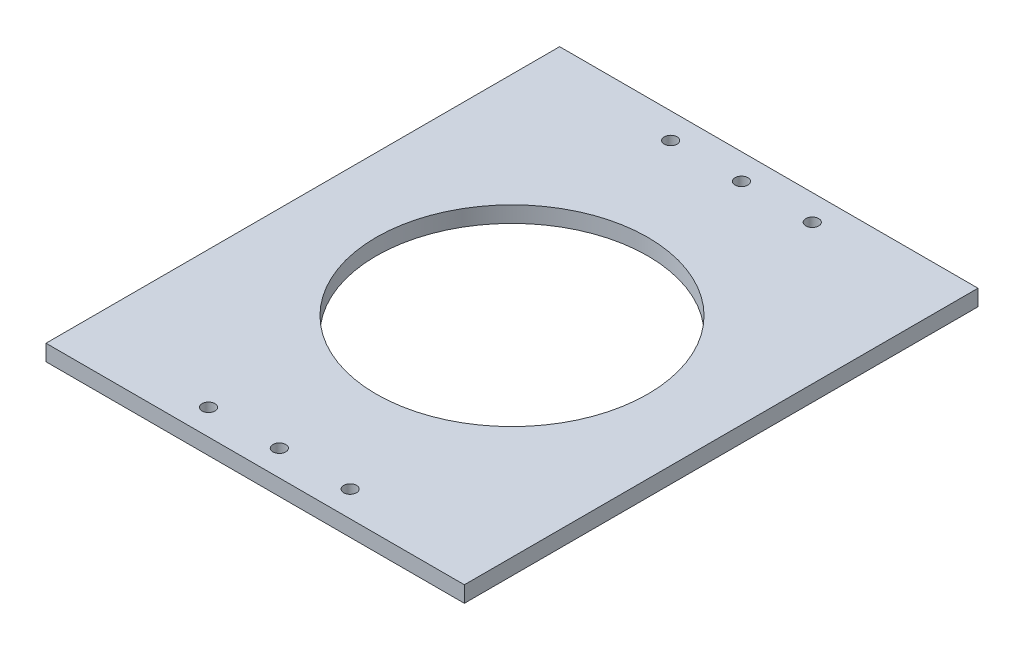
ISO-10303-21;
HEADER;
FILE_DESCRIPTION(('STEP AP214'),'2;1');
FILE_NAME('part.step','',(''),(''),'','','');
FILE_SCHEMA(('AUTOMOTIVE_DESIGN { 1 0 10303 214 1 1 1 1 }'));
ENDSEC;
DATA;
#1=APPLICATION_CONTEXT('core data for automotive mechanical design processes');
#2=APPLICATION_PROTOCOL_DEFINITION('international standard','automotive_design',2000,#1);
#3=PRODUCT_CONTEXT('',#1,'mechanical');
#4=PRODUCT('Part','Part','',(#3));
#5=PRODUCT_RELATED_PRODUCT_CATEGORY('part','',(#4));
#6=PRODUCT_DEFINITION_FORMATION('','',#4);
#7=PRODUCT_DEFINITION_CONTEXT('part definition',#1,'design');
#8=PRODUCT_DEFINITION('design','',#6,#7);
#9=PRODUCT_DEFINITION_SHAPE('','',#8);
#10=(LENGTH_UNIT() NAMED_UNIT(*) SI_UNIT(.MILLI.,.METRE.));
#11=(NAMED_UNIT(*) PLANE_ANGLE_UNIT() SI_UNIT($,.RADIAN.));
#12=(NAMED_UNIT(*) SI_UNIT($,.STERADIAN.) SOLID_ANGLE_UNIT());
#13=UNCERTAINTY_MEASURE_WITH_UNIT(LENGTH_MEASURE(1.E-05),#10,'distance_accuracy_value','');
#14=(GEOMETRIC_REPRESENTATION_CONTEXT(3) GLOBAL_UNCERTAINTY_ASSIGNED_CONTEXT((#13)) GLOBAL_UNIT_ASSIGNED_CONTEXT((#10,
#11,#12)) REPRESENTATION_CONTEXT('',''));
#15=CARTESIAN_POINT('',(0.,0.,0.));
#16=DIRECTION('',(0.,0.,1.));
#17=DIRECTION('',(1.,0.,0.));
#18=AXIS2_PLACEMENT_3D('',#15,#16,#17);
#19=CARTESIAN_POINT('',(0.,5.,0.));
#20=DIRECTION('',(0.,1.,0.));
#21=DIRECTION('',(0.,0.,1.));
#22=AXIS2_PLACEMENT_3D('',#19,#20,#21);
#23=PLANE('',#22);
#24=CARTESIAN_POINT('',(-277.162960230038,5.,36.1752773430498));
#25=DIRECTION('',(0.,1.,0.));
#26=DIRECTION('',(0.,0.,-1.));
#27=AXIS2_PLACEMENT_3D('',#24,#25,#26);
#28=CIRCLE('',#27,2.00000000000005);
#29=CARTESIAN_POINT('',(-277.162960230038,5.,34.1752773430497));
#30=VERTEX_POINT('',#29);
#31=EDGE_CURVE('E139',#30,#30,#28,.T.);
#32=ORIENTED_EDGE('',*,*,#31,.F.);
#33=EDGE_LOOP('',(#32));
#34=FACE_BOUND('',#33,.T.);
#35=CARTESIAN_POINT('',(-255.162960230037,5.,-107.42472265695));
#36=DIRECTION('',(0.,1.,0.));
#37=DIRECTION('',(0.,0.,1.));
#38=AXIS2_PLACEMENT_3D('',#35,#36,#37);
#39=CIRCLE('',#38,2.00000000000006);
#40=CARTESIAN_POINT('',(-255.162960230037,5.,-105.424722656949));
#41=VERTEX_POINT('',#40);
#42=EDGE_CURVE('E127',#41,#41,#39,.T.);
#43=ORIENTED_EDGE('',*,*,#42,.F.);
#44=EDGE_LOOP('',(#43));
#45=FACE_BOUND('',#44,.T.);
#46=CARTESIAN_POINT('',(-299.162960230037,5.,-107.42472265695));
#47=DIRECTION('',(0.,1.,0.));
#48=DIRECTION('',(0.,0.,1.));
#49=AXIS2_PLACEMENT_3D('',#46,#47,#48);
#50=CIRCLE('',#49,2.00000000000007);
#51=CARTESIAN_POINT('',(-299.162960230037,5.,-105.42472265695));
#52=VERTEX_POINT('',#51);
#53=EDGE_CURVE('E115',#52,#52,#50,.T.);
#54=ORIENTED_EDGE('',*,*,#53,.F.);
#55=EDGE_LOOP('',(#54));
#56=FACE_BOUND('',#55,.T.);
#57=DIRECTION('',(0.,0.,-1.));
#58=VECTOR('',#57,1.);
#59=CARTESIAN_POINT('',(-211.662960230037,5.,-115.42472265695));
#60=LINE('',#59,#58);
#61=CARTESIAN_POINT('',(-211.662960230037,5.,44.17527734305));
#62=VERTEX_POINT('',#61);
#63=CARTESIAN_POINT('',(-211.662960230037,5.,-115.42472265695));
#64=VERTEX_POINT('',#63);
#65=EDGE_CURVE('E85',#62,#64,#60,.T.);
#66=ORIENTED_EDGE('',*,*,#65,.T.);
#67=DIRECTION('',(-1.,0.,0.));
#68=VECTOR('',#67,1.);
#69=CARTESIAN_POINT('',(-341.662960230037,5.,-115.42472265695));
#70=LINE('',#69,#68);
#71=CARTESIAN_POINT('',(-341.662960230037,5.,-115.42472265695));
#72=VERTEX_POINT('',#71);
#73=EDGE_CURVE('E80',#64,#72,#70,.T.);
#74=ORIENTED_EDGE('',*,*,#73,.T.);
#75=DIRECTION('',(0.,0.,1.));
#76=VECTOR('',#75,1.);
#77=CARTESIAN_POINT('',(-341.662960230037,5.,-115.42472265695));
#78=LINE('',#77,#76);
#79=CARTESIAN_POINT('',(-341.662960230037,5.,44.17527734305));
#80=VERTEX_POINT('',#79);
#81=EDGE_CURVE('E83',#72,#80,#78,.T.);
#82=ORIENTED_EDGE('',*,*,#81,.T.);
#83=DIRECTION('',(1.,0.,0.));
#84=VECTOR('',#83,1.);
#85=CARTESIAN_POINT('',(-341.662960230037,5.,44.17527734305));
#86=LINE('',#85,#84);
#87=EDGE_CURVE('E50',#80,#62,#86,.T.);
#88=ORIENTED_EDGE('',*,*,#87,.T.);
#89=EDGE_LOOP('',(#66,#74,#82,#88));
#90=FACE_BOUND('',#89,.T.);
#91=CARTESIAN_POINT('',(-276.662960230037,5.,-35.62472265695));
#92=DIRECTION('',(0.,1.,0.));
#93=DIRECTION('',(0.,0.,1.));
#94=AXIS2_PLACEMENT_3D('',#91,#92,#93);
#95=CIRCLE('',#94,42.1978812813666);
#96=CARTESIAN_POINT('',(-276.662960230037,5.,6.57315862441667));
#97=VERTEX_POINT('',#96);
#98=EDGE_CURVE('E100',#97,#97,#95,.T.);
#99=ORIENTED_EDGE('',*,*,#98,.F.);
#100=EDGE_LOOP('',(#99));
#101=FACE_BOUND('',#100,.T.);
#102=CARTESIAN_POINT('',(-277.162960230037,5.,-107.42472265695));
#103=DIRECTION('',(0.,1.,0.));
#104=DIRECTION('',(0.,0.,1.));
#105=AXIS2_PLACEMENT_3D('',#102,#103,#104);
#106=CIRCLE('',#105,2.00000000000006);
#107=CARTESIAN_POINT('',(-277.162960230037,5.,-105.42472265695));
#108=VERTEX_POINT('',#107);
#109=EDGE_CURVE('E121',#108,#108,#106,.T.);
#110=ORIENTED_EDGE('',*,*,#109,.F.);
#111=EDGE_LOOP('',(#110));
#112=FACE_BOUND('',#111,.T.);
#113=CARTESIAN_POINT('',(-255.162960230037,5.,36.1752773430496));
#114=DIRECTION('',(0.,1.,0.));
#115=DIRECTION('',(0.,0.,-1.));
#116=AXIS2_PLACEMENT_3D('',#113,#114,#115);
#117=CIRCLE('',#116,2.00000000000005);
#118=CARTESIAN_POINT('',(-255.162960230037,5.,34.1752773430495));
#119=VERTEX_POINT('',#118);
#120=EDGE_CURVE('E133',#119,#119,#117,.T.);
#121=ORIENTED_EDGE('',*,*,#120,.F.);
#122=EDGE_LOOP('',(#121));
#123=FACE_BOUND('',#122,.T.);
#124=CARTESIAN_POINT('',(-299.162960230038,5.,36.17527734305));
#125=DIRECTION('',(0.,1.,0.));
#126=DIRECTION('',(0.,0.,-1.));
#127=AXIS2_PLACEMENT_3D('',#124,#125,#126);
#128=CIRCLE('',#127,2.00000000000005);
#129=CARTESIAN_POINT('',(-299.162960230038,5.,34.17527734305));
#130=VERTEX_POINT('',#129);
#131=EDGE_CURVE('E145',#130,#130,#128,.T.);
#132=ORIENTED_EDGE('',*,*,#131,.F.);
#133=EDGE_LOOP('',(#132));
#134=FACE_BOUND('',#133,.T.);
#135=ADVANCED_FACE('F33',(#34,#45,#56,#90,#101,#112,#123,#134),#23,.T.);
#136=CARTESIAN_POINT('',(0.,0.,0.));
#137=DIRECTION('',(0.,1.,0.));
#138=DIRECTION('',(0.,0.,1.));
#139=AXIS2_PLACEMENT_3D('',#136,#137,#138);
#140=PLANE('',#139);
#141=DIRECTION('',(0.,0.,-1.));
#142=VECTOR('',#141,1.);
#143=CARTESIAN_POINT('',(-211.662960230037,0.,-115.42472265695));
#144=LINE('',#143,#142);
#145=CARTESIAN_POINT('',(-211.662960230037,0.,44.17527734305));
#146=VERTEX_POINT('',#145);
#147=CARTESIAN_POINT('',(-211.662960230037,0.,-115.42472265695));
#148=VERTEX_POINT('',#147);
#149=EDGE_CURVE('E97',#146,#148,#144,.T.);
#150=ORIENTED_EDGE('',*,*,#149,.F.);
#151=DIRECTION('',(1.,0.,0.));
#152=VECTOR('',#151,1.);
#153=CARTESIAN_POINT('',(-341.662960230037,0.,44.17527734305));
#154=LINE('',#153,#152);
#155=CARTESIAN_POINT('',(-341.662960230037,0.,44.17527734305));
#156=VERTEX_POINT('',#155);
#157=EDGE_CURVE('E73',#156,#146,#154,.T.);
#158=ORIENTED_EDGE('',*,*,#157,.F.);
#159=DIRECTION('',(0.,0.,1.));
#160=VECTOR('',#159,1.);
#161=CARTESIAN_POINT('',(-341.662960230037,0.,-115.42472265695));
#162=LINE('',#161,#160);
#163=CARTESIAN_POINT('',(-341.662960230037,0.,-115.42472265695));
#164=VERTEX_POINT('',#163);
#165=EDGE_CURVE('E67',#164,#156,#162,.T.);
#166=ORIENTED_EDGE('',*,*,#165,.F.);
#167=DIRECTION('',(-1.,0.,0.));
#168=VECTOR('',#167,1.);
#169=CARTESIAN_POINT('',(-341.662960230037,0.,-115.42472265695));
#170=LINE('',#169,#168);
#171=EDGE_CURVE('E89',#148,#164,#170,.T.);
#172=ORIENTED_EDGE('',*,*,#171,.F.);
#173=EDGE_LOOP('',(#150,#158,#166,#172));
#174=FACE_BOUND('',#173,.T.);
#175=CARTESIAN_POINT('',(-276.662960230037,0.,-35.62472265695));
#176=DIRECTION('',(0.,1.,0.));
#177=DIRECTION('',(0.,0.,1.));
#178=AXIS2_PLACEMENT_3D('',#175,#176,#177);
#179=CIRCLE('',#178,42.1978812813666);
#180=CARTESIAN_POINT('',(-276.662960230037,0.,6.57315862441667));
#181=VERTEX_POINT('',#180);
#182=EDGE_CURVE('E112',#181,#181,#179,.T.);
#183=ORIENTED_EDGE('',*,*,#182,.T.);
#184=EDGE_LOOP('',(#183));
#185=FACE_BOUND('',#184,.T.);
#186=CARTESIAN_POINT('',(-299.162960230037,0.,-107.42472265695));
#187=DIRECTION('',(0.,1.,0.));
#188=DIRECTION('',(0.,0.,1.));
#189=AXIS2_PLACEMENT_3D('',#186,#187,#188);
#190=CIRCLE('',#189,2.00000000000007);
#191=CARTESIAN_POINT('',(-299.162960230037,0.,-105.42472265695));
#192=VERTEX_POINT('',#191);
#193=EDGE_CURVE('E118',#192,#192,#190,.T.);
#194=ORIENTED_EDGE('',*,*,#193,.T.);
#195=EDGE_LOOP('',(#194));
#196=FACE_BOUND('',#195,.T.);
#197=CARTESIAN_POINT('',(-277.162960230037,0.,-107.42472265695));
#198=DIRECTION('',(0.,1.,0.));
#199=DIRECTION('',(0.,0.,1.));
#200=AXIS2_PLACEMENT_3D('',#197,#198,#199);
#201=CIRCLE('',#200,2.00000000000006);
#202=CARTESIAN_POINT('',(-277.162960230037,0.,-105.42472265695));
#203=VERTEX_POINT('',#202);
#204=EDGE_CURVE('E124',#203,#203,#201,.T.);
#205=ORIENTED_EDGE('',*,*,#204,.T.);
#206=EDGE_LOOP('',(#205));
#207=FACE_BOUND('',#206,.T.);
#208=CARTESIAN_POINT('',(-255.162960230037,0.,-107.42472265695));
#209=DIRECTION('',(0.,1.,0.));
#210=DIRECTION('',(0.,0.,1.));
#211=AXIS2_PLACEMENT_3D('',#208,#209,#210);
#212=CIRCLE('',#211,2.00000000000006);
#213=CARTESIAN_POINT('',(-255.162960230037,0.,-105.424722656949));
#214=VERTEX_POINT('',#213);
#215=EDGE_CURVE('E130',#214,#214,#212,.T.);
#216=ORIENTED_EDGE('',*,*,#215,.T.);
#217=EDGE_LOOP('',(#216));
#218=FACE_BOUND('',#217,.T.);
#219=CARTESIAN_POINT('',(-255.162960230037,0.,36.1752773430496));
#220=DIRECTION('',(0.,1.,0.));
#221=DIRECTION('',(0.,0.,-1.));
#222=AXIS2_PLACEMENT_3D('',#219,#220,#221);
#223=CIRCLE('',#222,2.00000000000005);
#224=CARTESIAN_POINT('',(-255.162960230037,0.,34.1752773430495));
#225=VERTEX_POINT('',#224);
#226=EDGE_CURVE('E136',#225,#225,#223,.T.);
#227=ORIENTED_EDGE('',*,*,#226,.T.);
#228=EDGE_LOOP('',(#227));
#229=FACE_BOUND('',#228,.T.);
#230=CARTESIAN_POINT('',(-277.162960230038,0.,36.1752773430498));
#231=DIRECTION('',(0.,1.,0.));
#232=DIRECTION('',(0.,0.,-1.));
#233=AXIS2_PLACEMENT_3D('',#230,#231,#232);
#234=CIRCLE('',#233,2.00000000000005);
#235=CARTESIAN_POINT('',(-277.162960230038,0.,34.1752773430497));
#236=VERTEX_POINT('',#235);
#237=EDGE_CURVE('E142',#236,#236,#234,.T.);
#238=ORIENTED_EDGE('',*,*,#237,.T.);
#239=EDGE_LOOP('',(#238));
#240=FACE_BOUND('',#239,.T.);
#241=CARTESIAN_POINT('',(-299.162960230038,0.,36.17527734305));
#242=DIRECTION('',(0.,1.,0.));
#243=DIRECTION('',(0.,0.,-1.));
#244=AXIS2_PLACEMENT_3D('',#241,#242,#243);
#245=CIRCLE('',#244,2.00000000000005);
#246=CARTESIAN_POINT('',(-299.162960230038,0.,34.17527734305));
#247=VERTEX_POINT('',#246);
#248=EDGE_CURVE('E148',#247,#247,#245,.T.);
#249=ORIENTED_EDGE('',*,*,#248,.T.);
#250=EDGE_LOOP('',(#249));
#251=FACE_BOUND('',#250,.T.);
#252=ADVANCED_FACE('F108',(#174,#185,#196,#207,#218,#229,#240,#251),#140,.F.);
#253=CARTESIAN_POINT('',(-211.662960230037,5.,-115.42472265695));
#254=DIRECTION('',(-1.,0.,0.));
#255=DIRECTION('',(0.,0.,1.));
#256=AXIS2_PLACEMENT_3D('',#253,#254,#255);
#257=PLANE('',#256);
#258=ORIENTED_EDGE('',*,*,#149,.T.);
#259=DIRECTION('',(0.,-1.,0.));
#260=VECTOR('',#259,1.);
#261=CARTESIAN_POINT('',(-211.662960230037,5.,-115.42472265695));
#262=LINE('',#261,#260);
#263=EDGE_CURVE('E11',#64,#148,#262,.T.);
#264=ORIENTED_EDGE('',*,*,#263,.F.);
#265=ORIENTED_EDGE('',*,*,#65,.F.);
#266=DIRECTION('',(0.,-1.,0.));
#267=VECTOR('',#266,1.);
#268=CARTESIAN_POINT('',(-211.662960230037,5.,44.17527734305));
#269=LINE('',#268,#267);
#270=EDGE_CURVE('E93',#62,#146,#269,.T.);
#271=ORIENTED_EDGE('',*,*,#270,.T.);
#272=EDGE_LOOP('',(#258,#264,#265,#271));
#273=FACE_BOUND('',#272,.T.);
#274=ADVANCED_FACE('F35',(#273),#257,.F.);
#275=CARTESIAN_POINT('',(-341.662960230037,5.,-115.42472265695));
#276=DIRECTION('',(0.,0.,1.));
#277=DIRECTION('',(1.,0.,0.));
#278=AXIS2_PLACEMENT_3D('',#275,#276,#277);
#279=PLANE('',#278);
#280=ORIENTED_EDGE('',*,*,#171,.T.);
#281=DIRECTION('',(0.,-1.,0.));
#282=VECTOR('',#281,1.);
#283=CARTESIAN_POINT('',(-341.662960230037,5.,-115.42472265695));
#284=LINE('',#283,#282);
#285=EDGE_CURVE('E42',#72,#164,#284,.T.);
#286=ORIENTED_EDGE('',*,*,#285,.F.);
#287=ORIENTED_EDGE('',*,*,#73,.F.);
#288=ORIENTED_EDGE('',*,*,#263,.T.);
#289=EDGE_LOOP('',(#280,#286,#287,#288));
#290=FACE_BOUND('',#289,.T.);
#291=ADVANCED_FACE('F88',(#290),#279,.F.);
#292=CARTESIAN_POINT('',(-341.662960230037,5.,-115.42472265695));
#293=DIRECTION('',(1.,0.,0.));
#294=DIRECTION('',(0.,0.,-1.));
#295=AXIS2_PLACEMENT_3D('',#292,#293,#294);
#296=PLANE('',#295);
#297=ORIENTED_EDGE('',*,*,#165,.T.);
#298=DIRECTION('',(0.,-1.,0.));
#299=VECTOR('',#298,1.);
#300=CARTESIAN_POINT('',(-341.662960230037,5.,44.17527734305));
#301=LINE('',#300,#299);
#302=EDGE_CURVE('E90',#80,#156,#301,.T.);
#303=ORIENTED_EDGE('',*,*,#302,.F.);
#304=ORIENTED_EDGE('',*,*,#81,.F.);
#305=ORIENTED_EDGE('',*,*,#285,.T.);
#306=EDGE_LOOP('',(#297,#303,#304,#305));
#307=FACE_BOUND('',#306,.T.);
#308=ADVANCED_FACE('F91',(#307),#296,.F.);
#309=CARTESIAN_POINT('',(-341.662960230037,5.,44.17527734305));
#310=DIRECTION('',(0.,0.,-1.));
#311=DIRECTION('',(-1.,0.,0.));
#312=AXIS2_PLACEMENT_3D('',#309,#310,#311);
#313=PLANE('',#312);
#314=ORIENTED_EDGE('',*,*,#157,.T.);
#315=ORIENTED_EDGE('',*,*,#270,.F.);
#316=ORIENTED_EDGE('',*,*,#87,.F.);
#317=ORIENTED_EDGE('',*,*,#302,.T.);
#318=EDGE_LOOP('',(#314,#315,#316,#317));
#319=FACE_BOUND('',#318,.T.);
#320=ADVANCED_FACE('F105',(#319),#313,.F.);
#321=CARTESIAN_POINT('',(-276.662960230037,5.,-35.62472265695));
#322=DIRECTION('',(0.,-1.,0.));
#323=DIRECTION('',(0.,0.,-1.));
#324=AXIS2_PLACEMENT_3D('',#321,#322,#323);
#325=CYLINDRICAL_SURFACE('',#324,42.1978812813666);
#326=ORIENTED_EDGE('',*,*,#98,.T.);
#327=EDGE_LOOP('',(#326));
#328=FACE_BOUND('',#327,.T.);
#329=ORIENTED_EDGE('',*,*,#182,.F.);
#330=EDGE_LOOP('',(#329));
#331=FACE_BOUND('',#330,.T.);
#332=ADVANCED_FACE('F167',(#328,#331),#325,.F.);
#333=CARTESIAN_POINT('',(-299.162960230037,5.,-107.42472265695));
#334=DIRECTION('',(0.,-1.,0.));
#335=DIRECTION('',(0.,0.,-1.));
#336=AXIS2_PLACEMENT_3D('',#333,#334,#335);
#337=CYLINDRICAL_SURFACE('',#336,2.00000000000007);
#338=ORIENTED_EDGE('',*,*,#53,.T.);
#339=EDGE_LOOP('',(#338));
#340=FACE_BOUND('',#339,.T.);
#341=ORIENTED_EDGE('',*,*,#193,.F.);
#342=EDGE_LOOP('',(#341));
#343=FACE_BOUND('',#342,.T.);
#344=ADVANCED_FACE('F213',(#340,#343),#337,.F.);
#345=CARTESIAN_POINT('',(-277.162960230037,5.,-107.42472265695));
#346=DIRECTION('',(0.,-1.,0.));
#347=DIRECTION('',(0.,0.,-1.));
#348=AXIS2_PLACEMENT_3D('',#345,#346,#347);
#349=CYLINDRICAL_SURFACE('',#348,2.00000000000006);
#350=ORIENTED_EDGE('',*,*,#109,.T.);
#351=EDGE_LOOP('',(#350));
#352=FACE_BOUND('',#351,.T.);
#353=ORIENTED_EDGE('',*,*,#204,.F.);
#354=EDGE_LOOP('',(#353));
#355=FACE_BOUND('',#354,.T.);
#356=ADVANCED_FACE('F221',(#352,#355),#349,.F.);
#357=CARTESIAN_POINT('',(-255.162960230037,5.,-107.42472265695));
#358=DIRECTION('',(0.,-1.,0.));
#359=DIRECTION('',(0.,0.,-1.));
#360=AXIS2_PLACEMENT_3D('',#357,#358,#359);
#361=CYLINDRICAL_SURFACE('',#360,2.00000000000006);
#362=ORIENTED_EDGE('',*,*,#42,.T.);
#363=EDGE_LOOP('',(#362));
#364=FACE_BOUND('',#363,.T.);
#365=ORIENTED_EDGE('',*,*,#215,.F.);
#366=EDGE_LOOP('',(#365));
#367=FACE_BOUND('',#366,.T.);
#368=ADVANCED_FACE('F229',(#364,#367),#361,.F.);
#369=CARTESIAN_POINT('',(-255.162960230037,5.,36.1752773430496));
#370=DIRECTION('',(0.,-1.,0.));
#371=DIRECTION('',(0.,0.,-1.));
#372=AXIS2_PLACEMENT_3D('',#369,#370,#371);
#373=CYLINDRICAL_SURFACE('',#372,2.00000000000005);
#374=ORIENTED_EDGE('',*,*,#120,.T.);
#375=EDGE_LOOP('',(#374));
#376=FACE_BOUND('',#375,.T.);
#377=ORIENTED_EDGE('',*,*,#226,.F.);
#378=EDGE_LOOP('',(#377));
#379=FACE_BOUND('',#378,.T.);
#380=ADVANCED_FACE('F238',(#376,#379),#373,.F.);
#381=CARTESIAN_POINT('',(-277.162960230038,5.,36.1752773430498));
#382=DIRECTION('',(0.,-1.,0.));
#383=DIRECTION('',(0.,0.,-1.));
#384=AXIS2_PLACEMENT_3D('',#381,#382,#383);
#385=CYLINDRICAL_SURFACE('',#384,2.00000000000005);
#386=ORIENTED_EDGE('',*,*,#31,.T.);
#387=EDGE_LOOP('',(#386));
#388=FACE_BOUND('',#387,.T.);
#389=ORIENTED_EDGE('',*,*,#237,.F.);
#390=EDGE_LOOP('',(#389));
#391=FACE_BOUND('',#390,.T.);
#392=ADVANCED_FACE('F247',(#388,#391),#385,.F.);
#393=CARTESIAN_POINT('',(-299.162960230038,5.,36.17527734305));
#394=DIRECTION('',(0.,-1.,0.));
#395=DIRECTION('',(0.,0.,-1.));
#396=AXIS2_PLACEMENT_3D('',#393,#394,#395);
#397=CYLINDRICAL_SURFACE('',#396,2.00000000000005);
#398=ORIENTED_EDGE('',*,*,#131,.T.);
#399=EDGE_LOOP('',(#398));
#400=FACE_BOUND('',#399,.T.);
#401=ORIENTED_EDGE('',*,*,#248,.F.);
#402=EDGE_LOOP('',(#401));
#403=FACE_BOUND('',#402,.T.);
#404=ADVANCED_FACE('F154',(#400,#403),#397,.F.);
#405=CLOSED_SHELL('',(#135,#252,#274,#291,#308,#320,#332,#344,#356,#368,#380,#392,#404));
#406=MANIFOLD_SOLID_BREP('B2',#405);
#407=ADVANCED_BREP_SHAPE_REPRESENTATION('',(#18,#406),#14);
#408=SHAPE_DEFINITION_REPRESENTATION(#9,#407);
ENDSEC;
END-ISO-10303-21;
